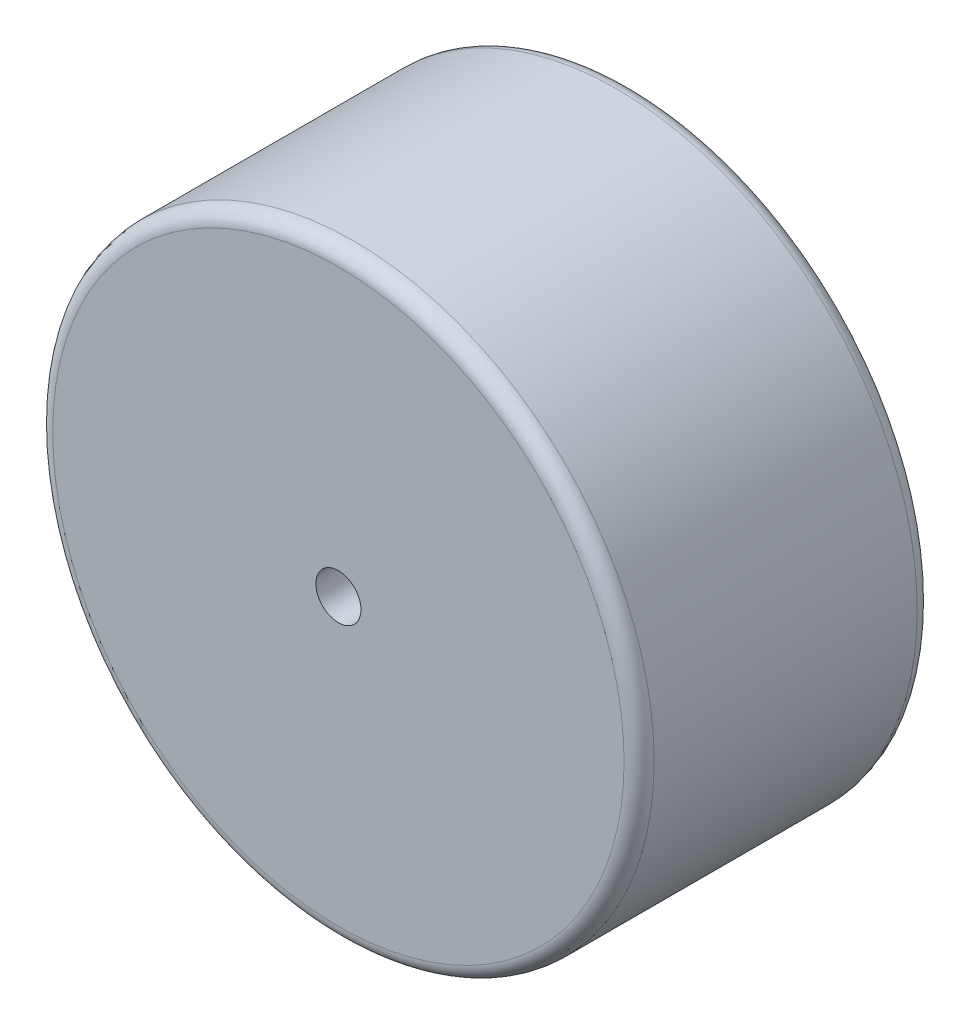
ISO-10303-21;
HEADER;
FILE_DESCRIPTION(('STEP AP214'),'2;1');
FILE_NAME('part.step','',(''),(''),'','','');
FILE_SCHEMA(('AUTOMOTIVE_DESIGN { 1 0 10303 214 1 1 1 1 }'));
ENDSEC;
DATA;
#1=APPLICATION_CONTEXT('core data for automotive mechanical design processes');
#2=APPLICATION_PROTOCOL_DEFINITION('international standard','automotive_design',2000,#1);
#3=PRODUCT_CONTEXT('',#1,'mechanical');
#4=PRODUCT('Part','Part','',(#3));
#5=PRODUCT_RELATED_PRODUCT_CATEGORY('part','',(#4));
#6=PRODUCT_DEFINITION_FORMATION('','',#4);
#7=PRODUCT_DEFINITION_CONTEXT('part definition',#1,'design');
#8=PRODUCT_DEFINITION('design','',#6,#7);
#9=PRODUCT_DEFINITION_SHAPE('','',#8);
#10=(LENGTH_UNIT() NAMED_UNIT(*) SI_UNIT(.MILLI.,.METRE.));
#11=(NAMED_UNIT(*) PLANE_ANGLE_UNIT() SI_UNIT($,.RADIAN.));
#12=(NAMED_UNIT(*) SI_UNIT($,.STERADIAN.) SOLID_ANGLE_UNIT());
#13=UNCERTAINTY_MEASURE_WITH_UNIT(LENGTH_MEASURE(1.E-05),#10,'distance_accuracy_value','');
#14=(GEOMETRIC_REPRESENTATION_CONTEXT(3) GLOBAL_UNCERTAINTY_ASSIGNED_CONTEXT((#13)) GLOBAL_UNIT_ASSIGNED_CONTEXT((#10,
#11,#12)) REPRESENTATION_CONTEXT('',''));
#15=CARTESIAN_POINT('',(0.,0.,0.));
#16=DIRECTION('',(0.,0.,1.));
#17=DIRECTION('',(1.,0.,0.));
#18=AXIS2_PLACEMENT_3D('',#15,#16,#17);
#19=CARTESIAN_POINT('',(0.,0.,19.5));
#20=DIRECTION('',(0.,0.,-1.));
#21=DIRECTION('',(-1.,0.,0.));
#22=AXIS2_PLACEMENT_3D('',#19,#20,#21);
#23=CYLINDRICAL_SURFACE('',#22,20.);
#24=CARTESIAN_POINT('',(0.,0.,1.));
#25=DIRECTION('',(0.,0.,1.));
#26=DIRECTION('',(1.,0.,0.));
#27=AXIS2_PLACEMENT_3D('',#24,#25,#26);
#28=CIRCLE('',#27,20.);
#29=CARTESIAN_POINT('',(20.,0.,1.));
#30=VERTEX_POINT('',#29);
#31=EDGE_CURVE('E51',#30,#30,#28,.T.);
#32=ORIENTED_EDGE('',*,*,#31,.T.);
#33=EDGE_LOOP('',(#32));
#34=FACE_BOUND('',#33,.T.);
#35=CARTESIAN_POINT('',(0.,0.,18.5));
#36=DIRECTION('',(0.,0.,1.));
#37=DIRECTION('',(1.,0.,0.));
#38=AXIS2_PLACEMENT_3D('',#35,#36,#37);
#39=CIRCLE('',#38,20.);
#40=CARTESIAN_POINT('',(20.,0.,18.5));
#41=VERTEX_POINT('',#40);
#42=EDGE_CURVE('E56',#41,#41,#39,.F.);
#43=ORIENTED_EDGE('',*,*,#42,.T.);
#44=EDGE_LOOP('',(#43));
#45=FACE_BOUND('',#44,.T.);
#46=ADVANCED_FACE('F39',(#34,#45),#23,.T.);
#47=CARTESIAN_POINT('',(0.,0.,19.5));
#48=DIRECTION('',(0.,0.,1.));
#49=DIRECTION('',(1.,0.,0.));
#50=AXIS2_PLACEMENT_3D('',#47,#48,#49);
#51=PLANE('',#50);
#52=CARTESIAN_POINT('',(0.,0.,19.5));
#53=DIRECTION('',(0.,0.,1.));
#54=DIRECTION('',(1.,0.,0.));
#55=AXIS2_PLACEMENT_3D('',#52,#53,#54);
#56=CIRCLE('',#55,1.5);
#57=CARTESIAN_POINT('',(1.5,0.,19.5));
#58=VERTEX_POINT('',#57);
#59=EDGE_CURVE('E59',#58,#58,#56,.T.);
#60=ORIENTED_EDGE('',*,*,#59,.F.);
#61=EDGE_LOOP('',(#60));
#62=FACE_BOUND('',#61,.T.);
#63=CARTESIAN_POINT('',(0.,0.,19.5));
#64=DIRECTION('',(0.,0.,1.));
#65=DIRECTION('',(1.,0.,0.));
#66=AXIS2_PLACEMENT_3D('',#63,#64,#65);
#67=CIRCLE('',#66,19.);
#68=CARTESIAN_POINT('',(19.,0.,19.5));
#69=VERTEX_POINT('',#68);
#70=EDGE_CURVE('E10',#69,#69,#67,.T.);
#71=ORIENTED_EDGE('',*,*,#70,.T.);
#72=EDGE_LOOP('',(#71));
#73=FACE_BOUND('',#72,.T.);
#74=ADVANCED_FACE('F80',(#62,#73),#51,.T.);
#75=CARTESIAN_POINT('',(0.,0.,0.));
#76=DIRECTION('',(0.,0.,1.));
#77=DIRECTION('',(1.,0.,0.));
#78=AXIS2_PLACEMENT_3D('',#75,#76,#77);
#79=PLANE('',#78);
#80=CARTESIAN_POINT('',(0.,0.,0.));
#81=DIRECTION('',(0.,0.,1.));
#82=DIRECTION('',(1.,0.,0.));
#83=AXIS2_PLACEMENT_3D('',#80,#81,#82);
#84=CIRCLE('',#83,1.5);
#85=CARTESIAN_POINT('',(1.5,0.,0.));
#86=VERTEX_POINT('',#85);
#87=EDGE_CURVE('E43',#86,#86,#84,.T.);
#88=ORIENTED_EDGE('',*,*,#87,.T.);
#89=EDGE_LOOP('',(#88));
#90=FACE_BOUND('',#89,.T.);
#91=CARTESIAN_POINT('',(0.,0.,0.));
#92=DIRECTION('',(0.,0.,1.));
#93=DIRECTION('',(1.,0.,0.));
#94=AXIS2_PLACEMENT_3D('',#91,#92,#93);
#95=CIRCLE('',#94,19.);
#96=CARTESIAN_POINT('',(19.,0.,0.));
#97=VERTEX_POINT('',#96);
#98=EDGE_CURVE('E47',#97,#97,#95,.F.);
#99=ORIENTED_EDGE('',*,*,#98,.T.);
#100=EDGE_LOOP('',(#99));
#101=FACE_BOUND('',#100,.T.);
#102=ADVANCED_FACE('F66',(#90,#101),#79,.F.);
#103=CARTESIAN_POINT('',(0.,0.,1.));
#104=DIRECTION('',(0.,0.,1.));
#105=DIRECTION('',(1.,0.,0.));
#106=AXIS2_PLACEMENT_3D('',#103,#104,#105);
#107=TOROIDAL_SURFACE('',#106,19.,1.);
#108=ORIENTED_EDGE('',*,*,#98,.F.);
#109=EDGE_LOOP('',(#108));
#110=FACE_BOUND('',#109,.T.);
#111=ORIENTED_EDGE('',*,*,#31,.F.);
#112=EDGE_LOOP('',(#111));
#113=FACE_BOUND('',#112,.T.);
#114=ADVANCED_FACE('F76',(#110,#113),#107,.T.);
#115=CARTESIAN_POINT('',(0.,0.,18.5));
#116=DIRECTION('',(0.,0.,1.));
#117=DIRECTION('',(1.,0.,0.));
#118=AXIS2_PLACEMENT_3D('',#115,#116,#117);
#119=TOROIDAL_SURFACE('',#118,19.,1.);
#120=ORIENTED_EDGE('',*,*,#42,.F.);
#121=EDGE_LOOP('',(#120));
#122=FACE_BOUND('',#121,.T.);
#123=ORIENTED_EDGE('',*,*,#70,.F.);
#124=EDGE_LOOP('',(#123));
#125=FACE_BOUND('',#124,.T.);
#126=ADVANCED_FACE('F41',(#122,#125),#119,.T.);
#127=CARTESIAN_POINT('',(0.,0.,-0.5));
#128=DIRECTION('',(0.,0.,1.));
#129=DIRECTION('',(1.,0.,0.));
#130=AXIS2_PLACEMENT_3D('',#127,#128,#129);
#131=CYLINDRICAL_SURFACE('',#130,1.5);
#132=ORIENTED_EDGE('',*,*,#59,.T.);
#133=EDGE_LOOP('',(#132));
#134=FACE_BOUND('',#133,.T.);
#135=ORIENTED_EDGE('',*,*,#87,.F.);
#136=EDGE_LOOP('',(#135));
#137=FACE_BOUND('',#136,.T.);
#138=ADVANCED_FACE('F69',(#134,#137),#131,.F.);
#139=CLOSED_SHELL('',(#46,#74,#102,#114,#126,#138));
#140=MANIFOLD_SOLID_BREP('B2',#139);
#141=ADVANCED_BREP_SHAPE_REPRESENTATION('',(#18,#140),#14);
#142=SHAPE_DEFINITION_REPRESENTATION(#9,#141);
ENDSEC;
END-ISO-10303-21;
